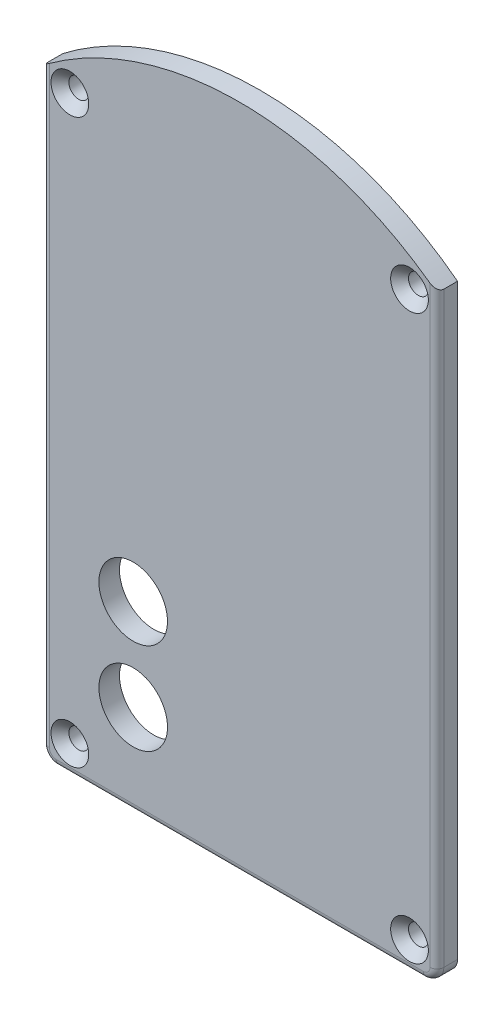
ISO-10303-21;
HEADER;
FILE_DESCRIPTION(('STEP AP214'),'2;1');
FILE_NAME('part.step','',(''),(''),'','','');
FILE_SCHEMA(('AUTOMOTIVE_DESIGN { 1 0 10303 214 1 1 1 1 }'));
ENDSEC;
DATA;
#1=APPLICATION_CONTEXT('core data for automotive mechanical design processes');
#2=APPLICATION_PROTOCOL_DEFINITION('international standard','automotive_design',2000,#1);
#3=PRODUCT_CONTEXT('',#1,'mechanical');
#4=PRODUCT('Part','Part','',(#3));
#5=PRODUCT_RELATED_PRODUCT_CATEGORY('part','',(#4));
#6=PRODUCT_DEFINITION_FORMATION('','',#4);
#7=PRODUCT_DEFINITION_CONTEXT('part definition',#1,'design');
#8=PRODUCT_DEFINITION('design','',#6,#7);
#9=PRODUCT_DEFINITION_SHAPE('','',#8);
#10=(LENGTH_UNIT() NAMED_UNIT(*) SI_UNIT(.MILLI.,.METRE.));
#11=(NAMED_UNIT(*) PLANE_ANGLE_UNIT() SI_UNIT($,.RADIAN.));
#12=(NAMED_UNIT(*) SI_UNIT($,.STERADIAN.) SOLID_ANGLE_UNIT());
#13=UNCERTAINTY_MEASURE_WITH_UNIT(LENGTH_MEASURE(1.E-05),#10,'distance_accuracy_value','');
#14=(GEOMETRIC_REPRESENTATION_CONTEXT(3) GLOBAL_UNCERTAINTY_ASSIGNED_CONTEXT((#13)) GLOBAL_UNIT_ASSIGNED_CONTEXT((#10,
#11,#12)) REPRESENTATION_CONTEXT('',''));
#15=CARTESIAN_POINT('',(0.,0.,0.));
#16=DIRECTION('',(0.,0.,1.));
#17=DIRECTION('',(1.,0.,0.));
#18=AXIS2_PLACEMENT_3D('',#15,#16,#17);
#19=CARTESIAN_POINT('',(26.75,-48.,2.));
#20=DIRECTION('',(0.,0.,1.));
#21=DIRECTION('',(1.,0.,0.));
#22=AXIS2_PLACEMENT_3D('',#19,#20,#21);
#23=DEGENERATE_TOROIDAL_SURFACE('',#22,1.,1.,.T.);
#24=CARTESIAN_POINT('',(27.75,-48.,2.));
#25=DIRECTION('',(0.,1.,0.));
#26=DIRECTION('',(0.,0.,1.));
#27=AXIS2_PLACEMENT_3D('',#24,#25,#26);
#28=CIRCLE('',#27,1.);
#29=CARTESIAN_POINT('',(27.75,-48.,3.));
#30=VERTEX_POINT('',#29);
#31=CARTESIAN_POINT('',(28.75,-48.,2.));
#32=VERTEX_POINT('',#31);
#33=EDGE_CURVE('E11',#30,#32,#28,.T.);
#34=ORIENTED_EDGE('',*,*,#33,.F.);
#35=CARTESIAN_POINT('',(26.75,-48.,3.));
#36=DIRECTION('',(0.,0.,1.));
#37=DIRECTION('',(1.,0.,0.));
#38=AXIS2_PLACEMENT_3D('',#35,#36,#37);
#39=CIRCLE('',#38,1.);
#40=CARTESIAN_POINT('',(26.75,-49.,3.));
#41=VERTEX_POINT('',#40);
#42=EDGE_CURVE('E157',#41,#30,#39,.T.);
#43=ORIENTED_EDGE('',*,*,#42,.F.);
#44=CARTESIAN_POINT('',(26.75,-49.,2.));
#45=DIRECTION('',(1.,0.,0.));
#46=DIRECTION('',(0.,0.,-1.));
#47=AXIS2_PLACEMENT_3D('',#44,#45,#46);
#48=CIRCLE('',#47,1.);
#49=CARTESIAN_POINT('',(26.75,-50.,2.));
#50=VERTEX_POINT('',#49);
#51=EDGE_CURVE('E44',#41,#50,#48,.T.);
#52=ORIENTED_EDGE('',*,*,#51,.T.);
#53=CARTESIAN_POINT('',(26.75,-48.,2.));
#54=DIRECTION('',(0.,0.,1.));
#55=DIRECTION('',(1.,0.,0.));
#56=AXIS2_PLACEMENT_3D('',#53,#54,#55);
#57=CIRCLE('',#56,2.);
#58=EDGE_CURVE('E217',#32,#50,#57,.F.);
#59=ORIENTED_EDGE('',*,*,#58,.F.);
#60=EDGE_LOOP('',(#34,#43,#52,#59));
#61=FACE_BOUND('',#60,.T.);
#62=ADVANCED_FACE('F37',(#61),#23,.T.);
#63=CARTESIAN_POINT('',(0.,-49.,2.));
#64=DIRECTION('',(-1.,0.,0.));
#65=DIRECTION('',(0.,0.,1.));
#66=AXIS2_PLACEMENT_3D('',#63,#64,#65);
#67=CYLINDRICAL_SURFACE('',#66,1.);
#68=ORIENTED_EDGE('',*,*,#51,.F.);
#69=DIRECTION('',(1.,0.,0.));
#70=VECTOR('',#69,1.);
#71=CARTESIAN_POINT('',(0.,-49.,3.));
#72=LINE('',#71,#70);
#73=CARTESIAN_POINT('',(-26.75,-49.,3.));
#74=VERTEX_POINT('',#73);
#75=EDGE_CURVE('E160',#74,#41,#72,.T.);
#76=ORIENTED_EDGE('',*,*,#75,.F.);
#77=CARTESIAN_POINT('',(-26.75,-49.,2.));
#78=DIRECTION('',(1.,0.,0.));
#79=DIRECTION('',(0.,0.,-1.));
#80=AXIS2_PLACEMENT_3D('',#77,#78,#79);
#81=CIRCLE('',#80,1.);
#82=CARTESIAN_POINT('',(-26.75,-50.,2.));
#83=VERTEX_POINT('',#82);
#84=EDGE_CURVE('E212',#74,#83,#81,.T.);
#85=ORIENTED_EDGE('',*,*,#84,.T.);
#86=DIRECTION('',(1.,0.,0.));
#87=VECTOR('',#86,1.);
#88=CARTESIAN_POINT('',(0.,-50.,2.));
#89=LINE('',#88,#87);
#90=EDGE_CURVE('E211',#50,#83,#89,.F.);
#91=ORIENTED_EDGE('',*,*,#90,.F.);
#92=EDGE_LOOP('',(#68,#76,#85,#91));
#93=FACE_BOUND('',#92,.T.);
#94=ADVANCED_FACE('F201',(#93),#67,.T.);
#95=CARTESIAN_POINT('',(-26.75,-48.,2.));
#96=DIRECTION('',(0.,0.,1.));
#97=DIRECTION('',(1.,0.,0.));
#98=AXIS2_PLACEMENT_3D('',#95,#96,#97);
#99=DEGENERATE_TOROIDAL_SURFACE('',#98,1.,1.,.T.);
#100=ORIENTED_EDGE('',*,*,#84,.F.);
#101=CARTESIAN_POINT('',(-26.75,-48.,3.));
#102=DIRECTION('',(0.,0.,1.));
#103=DIRECTION('',(1.,0.,0.));
#104=AXIS2_PLACEMENT_3D('',#101,#102,#103);
#105=CIRCLE('',#104,1.);
#106=CARTESIAN_POINT('',(-27.75,-48.,3.));
#107=VERTEX_POINT('',#106);
#108=EDGE_CURVE('E163',#107,#74,#105,.T.);
#109=ORIENTED_EDGE('',*,*,#108,.F.);
#110=CARTESIAN_POINT('',(-27.75,-48.,2.));
#111=DIRECTION('',(0.,-1.,0.));
#112=DIRECTION('',(0.,0.,-1.));
#113=AXIS2_PLACEMENT_3D('',#110,#111,#112);
#114=CIRCLE('',#113,1.);
#115=CARTESIAN_POINT('',(-28.75,-48.,2.));
#116=VERTEX_POINT('',#115);
#117=EDGE_CURVE('E226',#107,#116,#114,.T.);
#118=ORIENTED_EDGE('',*,*,#117,.T.);
#119=CARTESIAN_POINT('',(-26.75,-48.,2.));
#120=DIRECTION('',(0.,0.,1.));
#121=DIRECTION('',(1.,0.,0.));
#122=AXIS2_PLACEMENT_3D('',#119,#120,#121);
#123=CIRCLE('',#122,2.);
#124=EDGE_CURVE('E235',#83,#116,#123,.F.);
#125=ORIENTED_EDGE('',*,*,#124,.F.);
#126=EDGE_LOOP('',(#100,#109,#118,#125));
#127=FACE_BOUND('',#126,.T.);
#128=ADVANCED_FACE('F198',(#127),#99,.T.);
#129=CARTESIAN_POINT('',(-27.75,0.,2.));
#130=DIRECTION('',(0.,1.,0.));
#131=DIRECTION('',(-1.,0.,0.));
#132=AXIS2_PLACEMENT_3D('',#129,#130,#131);
#133=CYLINDRICAL_SURFACE('',#132,1.);
#134=ORIENTED_EDGE('',*,*,#117,.F.);
#135=DIRECTION('',(0.,-1.,0.));
#136=VECTOR('',#135,1.);
#137=CARTESIAN_POINT('',(-27.75,0.,3.));
#138=LINE('',#137,#136);
#139=CARTESIAN_POINT('',(-27.75,38.3537755638216,3.));
#140=VERTEX_POINT('',#139);
#141=EDGE_CURVE('E166',#140,#107,#138,.T.);
#142=ORIENTED_EDGE('',*,*,#141,.F.);
#143=CARTESIAN_POINT('',(-28.75,37.61,2.));
#144=CARTESIAN_POINT('',(-28.7500022722905,37.6099981037718,2.02410175027097));
#145=CARTESIAN_POINT('',(-28.7491279451692,37.6106666342027,2.04818996193009));
#146=CARTESIAN_POINT('',(-28.7456562797687,37.6133201448274,2.09615648428981));
#147=CARTESIAN_POINT('',(-28.7430598462691,37.6153044337333,2.12003489854455));
#148=CARTESIAN_POINT('',(-28.7327793158311,37.623158697966,2.19078854732016));
#149=CARTESIAN_POINT('',(-28.7226030260045,37.6309308415264,2.23712340857814));
#150=CARTESIAN_POINT('',(-28.6962330131471,37.6510435476155,2.32685198090156));
#151=CARTESIAN_POINT('',(-28.6800496066799,37.6633762777018,2.37025058446503));
#152=CARTESIAN_POINT('',(-28.6424784736019,37.6919564770102,2.45339460940018));
#153=CARTESIAN_POINT('',(-28.621083509407,37.7082093901011,2.49313484350643));
#154=CARTESIAN_POINT('',(-28.5722213409678,37.745248348285,2.5711629402715));
#155=CARTESIAN_POINT('',(-28.5444206175567,37.7662818195653,2.60912232766916));
#156=CARTESIAN_POINT('',(-28.4848435709094,37.8112374975394,2.67981174487165));
#157=CARTESIAN_POINT('',(-28.45306632852,37.8351603720602,2.7125405616596));
#158=CARTESIAN_POINT('',(-28.3798087803835,37.8901509322634,2.77860735748289));
#159=CARTESIAN_POINT('',(-28.3376505119854,37.9216974818019,2.81079387113862));
#160=CARTESIAN_POINT('',(-28.2500392453336,37.9870093175237,2.86757766108698));
#161=CARTESIAN_POINT('',(-28.2045825457174,38.0207770921761,2.89216624343736));
#162=CARTESIAN_POINT('',(-28.1020836384667,38.0966182542056,2.93796848285641));
#163=CARTESIAN_POINT('',(-28.0445372550535,38.139006266507,2.95753435291841));
#164=CARTESIAN_POINT('',(-27.9276306421015,38.2246946713548,2.98593097636432));
#165=CARTESIAN_POINT('',(-27.8682729358103,38.2679937707442,2.99477602192797));
#166=CARTESIAN_POINT('',(-27.7891241366535,38.3254455467905,2.99942566566217));
#167=CARTESIAN_POINT('',(-27.7695639070646,38.3396208652445,2.9999995816304));
#168=CARTESIAN_POINT('',(-27.75,38.3537755638216,3.));
#169=B_SPLINE_CURVE_WITH_KNOTS('',3,(#143,#144,#145,#146,#147,#148,#149,#150,#151,#152,#153,
#154,#155,#156,#157,#158,#159,#160,#161,#162,#163,#164,#165,#166,#167,#168),.UNSPECIFIED.,.F.,
.F.,(4,2,2,2,2,2,2,2,2,2,2,2,4),(0.,0.0722541456494997,0.144470359646708,0.287893976458827,
0.431072410065434,0.574450828771389,0.728505209145205,0.882595264448869,1.0670573316286,
1.25172969476195,1.47318614546049,1.69434704156364,1.7668073530059),.UNSPECIFIED.);
#170=CARTESIAN_POINT('',(-28.75,37.61,2.));
#171=VERTEX_POINT('',#170);
#172=EDGE_CURVE('E178',#171,#140,#169,.T.);
#173=ORIENTED_EDGE('',*,*,#172,.F.);
#174=DIRECTION('',(0.,-1.,0.));
#175=VECTOR('',#174,1.);
#176=CARTESIAN_POINT('',(-28.75,0.,2.));
#177=LINE('',#176,#175);
#178=EDGE_CURVE('E113',#116,#171,#177,.F.);
#179=ORIENTED_EDGE('',*,*,#178,.F.);
#180=EDGE_LOOP('',(#134,#142,#173,#179));
#181=FACE_BOUND('',#180,.T.);
#182=ADVANCED_FACE('F193',(#181),#133,.T.);
#183=CARTESIAN_POINT('',(27.75,0.,2.));
#184=DIRECTION('',(0.,-1.,0.));
#185=DIRECTION('',(1.,0.,0.));
#186=AXIS2_PLACEMENT_3D('',#183,#184,#185);
#187=CYLINDRICAL_SURFACE('',#186,1.);
#188=DIRECTION('',(0.,1.,0.));
#189=VECTOR('',#188,1.);
#190=CARTESIAN_POINT('',(27.75,0.,3.));
#191=LINE('',#190,#189);
#192=CARTESIAN_POINT('',(27.75,38.3537755638216,3.));
#193=VERTEX_POINT('',#192);
#194=EDGE_CURVE('E154',#30,#193,#191,.T.);
#195=ORIENTED_EDGE('',*,*,#194,.F.);
#196=ORIENTED_EDGE('',*,*,#33,.T.);
#197=DIRECTION('',(0.,1.,0.));
#198=VECTOR('',#197,1.);
#199=CARTESIAN_POINT('',(28.75,0.,2.));
#200=LINE('',#199,#198);
#201=CARTESIAN_POINT('',(28.75,37.61,2.));
#202=VERTEX_POINT('',#201);
#203=EDGE_CURVE('E221',#202,#32,#200,.F.);
#204=ORIENTED_EDGE('',*,*,#203,.F.);
#205=CARTESIAN_POINT('',(27.75,38.3537755638216,3.));
#206=CARTESIAN_POINT('',(27.8184181665754,38.3042849041995,2.99996498562351));
#207=CARTESIAN_POINT('',(27.8867670368836,38.2545423580024,2.99297235887581));
#208=CARTESIAN_POINT('',(28.0219913192911,38.1555952864358,2.96481148038245));
#209=CARTESIAN_POINT('',(28.0888441042951,38.10640168804,2.94349699243492));
#210=CARTESIAN_POINT('',(28.2177655141988,38.011034636967,2.88663448323563));
#211=CARTESIAN_POINT('',(28.27986547152,37.9648417765026,2.85119139049506));
#212=CARTESIAN_POINT('',(28.396944823377,37.8773468475039,2.76594119668793));
#213=CARTESIAN_POINT('',(28.4519582166699,37.8360215149637,2.71620668499692));
#214=CARTESIAN_POINT('',(28.5341632679123,37.7740360505548,2.62249978544291));
#215=CARTESIAN_POINT('',(28.5643614992486,37.7511991837649,2.58258103775148));
#216=CARTESIAN_POINT('',(28.619189459037,37.7096509294579,2.49707454196982));
#217=CARTESIAN_POINT('',(28.6438189291835,37.69093973331,2.45148653106431));
#218=CARTESIAN_POINT('',(28.6863535248993,37.6585773624755,2.35503007169893));
#219=CARTESIAN_POINT('',(28.7041955639022,37.6449736746313,2.30411743611234));
#220=CARTESIAN_POINT('',(28.7315126278006,37.6241290487321,2.19890732222184));
#221=CARTESIAN_POINT('',(28.7410116052889,37.6168698960689,2.14462001614855));
#222=CARTESIAN_POINT('',(28.7473069477977,37.6120584836836,2.0748754785192));
#223=CARTESIAN_POINT('',(28.7483165592948,37.6112868019096,2.05991954871388));
#224=CARTESIAN_POINT('',(28.7496620131079,37.6102583836259,2.02997832766394));
#225=CARTESIAN_POINT('',(28.749998689021,37.6100010100185,2.01499309579164));
#226=CARTESIAN_POINT('',(28.75,37.61,2.));
#227=B_SPLINE_CURVE_WITH_KNOTS('',3,(#205,#206,#207,#208,#209,#210,#211,#212,#213,#214,#215,
#216,#217,#218,#219,#220,#221,#222,#223,#224,#225,#226),.UNSPECIFIED.,.F.,.F.,(4,2,2,2,2,2,2,2,
2,2,4),(0.,0.253197121276922,0.509019660948762,0.762976668339778,1.01566590506285,
1.18010633079928,1.34455438249659,1.51049559742968,1.67595882975645,1.72097226731186,
1.76592990996017),.UNSPECIFIED.);
#228=EDGE_CURVE('E170',#193,#202,#227,.T.);
#229=ORIENTED_EDGE('',*,*,#228,.F.);
#230=EDGE_LOOP('',(#195,#196,#204,#229));
#231=FACE_BOUND('',#230,.T.);
#232=ADVANCED_FACE('F188',(#231),#187,.T.);
#233=CARTESIAN_POINT('',(26.75,-48.,3.));
#234=DIRECTION('',(0.,0.,-1.));
#235=DIRECTION('',(-1.,0.,0.));
#236=AXIS2_PLACEMENT_3D('',#233,#234,#235);
#237=CYLINDRICAL_SURFACE('',#236,2.);
#238=DIRECTION('',(0.,0.,-1.));
#239=VECTOR('',#238,1.);
#240=CARTESIAN_POINT('',(28.75,-48.,3.));
#241=LINE('',#240,#239);
#242=CARTESIAN_POINT('',(28.75,-48.,0.));
#243=VERTEX_POINT('',#242);
#244=EDGE_CURVE('E147',#32,#243,#241,.T.);
#245=ORIENTED_EDGE('',*,*,#244,.F.);
#246=ORIENTED_EDGE('',*,*,#58,.T.);
#247=DIRECTION('',(0.,0.,-1.));
#248=VECTOR('',#247,1.);
#249=CARTESIAN_POINT('',(26.75,-50.,3.));
#250=LINE('',#249,#248);
#251=CARTESIAN_POINT('',(26.75,-50.,0.));
#252=VERTEX_POINT('',#251);
#253=EDGE_CURVE('E149',#252,#50,#250,.F.);
#254=ORIENTED_EDGE('',*,*,#253,.F.);
#255=CARTESIAN_POINT('',(26.75,-48.,0.));
#256=DIRECTION('',(0.,0.,1.));
#257=DIRECTION('',(1.,0.,0.));
#258=AXIS2_PLACEMENT_3D('',#255,#256,#257);
#259=CIRCLE('',#258,2.);
#260=EDGE_CURVE('E152',#243,#252,#259,.F.);
#261=ORIENTED_EDGE('',*,*,#260,.F.);
#262=EDGE_LOOP('',(#245,#246,#254,#261));
#263=FACE_BOUND('',#262,.T.);
#264=ADVANCED_FACE('F192',(#263),#237,.T.);
#265=CARTESIAN_POINT('',(-26.75,-48.,3.));
#266=DIRECTION('',(0.,0.,-1.));
#267=DIRECTION('',(-1.,0.,0.));
#268=AXIS2_PLACEMENT_3D('',#265,#266,#267);
#269=CYLINDRICAL_SURFACE('',#268,2.);
#270=DIRECTION('',(0.,0.,-1.));
#271=VECTOR('',#270,1.);
#272=CARTESIAN_POINT('',(-26.75,-50.,3.));
#273=LINE('',#272,#271);
#274=CARTESIAN_POINT('',(-26.75,-50.,0.));
#275=VERTEX_POINT('',#274);
#276=EDGE_CURVE('E138',#83,#275,#273,.T.);
#277=ORIENTED_EDGE('',*,*,#276,.F.);
#278=ORIENTED_EDGE('',*,*,#124,.T.);
#279=DIRECTION('',(0.,0.,-1.));
#280=VECTOR('',#279,1.);
#281=CARTESIAN_POINT('',(-28.75,-48.,3.));
#282=LINE('',#281,#280);
#283=CARTESIAN_POINT('',(-28.75,-48.,0.));
#284=VERTEX_POINT('',#283);
#285=EDGE_CURVE('E144',#284,#116,#282,.F.);
#286=ORIENTED_EDGE('',*,*,#285,.F.);
#287=CARTESIAN_POINT('',(-26.75,-48.,0.));
#288=DIRECTION('',(0.,0.,1.));
#289=DIRECTION('',(1.,0.,0.));
#290=AXIS2_PLACEMENT_3D('',#287,#288,#289);
#291=CIRCLE('',#290,2.);
#292=EDGE_CURVE('E132',#275,#284,#291,.F.);
#293=ORIENTED_EDGE('',*,*,#292,.F.);
#294=EDGE_LOOP('',(#277,#278,#286,#293));
#295=FACE_BOUND('',#294,.T.);
#296=ADVANCED_FACE('F238',(#295),#269,.T.);
#297=CARTESIAN_POINT('',(28.75,50.,3.));
#298=DIRECTION('',(-1.,0.,0.));
#299=DIRECTION('',(0.,-1.,0.));
#300=AXIS2_PLACEMENT_3D('',#297,#298,#299);
#301=PLANE('',#300);
#302=DIRECTION('',(0.,0.,-1.));
#303=VECTOR('',#302,1.);
#304=CARTESIAN_POINT('',(28.75,37.61,3.001));
#305=LINE('',#304,#303);
#306=CARTESIAN_POINT('',(28.75,37.61,0.));
#307=VERTEX_POINT('',#306);
#308=EDGE_CURVE('E116',#202,#307,#305,.T.);
#309=ORIENTED_EDGE('',*,*,#308,.F.);
#310=ORIENTED_EDGE('',*,*,#203,.T.);
#311=ORIENTED_EDGE('',*,*,#244,.T.);
#312=DIRECTION('',(0.,1.,0.));
#313=VECTOR('',#312,1.);
#314=CARTESIAN_POINT('',(28.75,50.,0.));
#315=LINE('',#314,#313);
#316=EDGE_CURVE('E135',#243,#307,#315,.T.);
#317=ORIENTED_EDGE('',*,*,#316,.T.);
#318=EDGE_LOOP('',(#309,#310,#311,#317));
#319=FACE_BOUND('',#318,.T.);
#320=ADVANCED_FACE('F225',(#319),#301,.F.);
#321=CARTESIAN_POINT('',(-28.75,50.,3.));
#322=DIRECTION('',(1.,0.,0.));
#323=DIRECTION('',(0.,1.,0.));
#324=AXIS2_PLACEMENT_3D('',#321,#322,#323);
#325=PLANE('',#324);
#326=ORIENTED_EDGE('',*,*,#285,.T.);
#327=ORIENTED_EDGE('',*,*,#178,.T.);
#328=DIRECTION('',(0.,0.,-1.));
#329=VECTOR('',#328,1.);
#330=CARTESIAN_POINT('',(-28.75,37.61,3.001));
#331=LINE('',#330,#329);
#332=CARTESIAN_POINT('',(-28.75,37.61,0.));
#333=VERTEX_POINT('',#332);
#334=EDGE_CURVE('E106',#171,#333,#331,.T.);
#335=ORIENTED_EDGE('',*,*,#334,.T.);
#336=DIRECTION('',(0.,-1.,0.));
#337=VECTOR('',#336,1.);
#338=CARTESIAN_POINT('',(-28.75,50.,0.));
#339=LINE('',#338,#337);
#340=EDGE_CURVE('E111',#333,#284,#339,.T.);
#341=ORIENTED_EDGE('',*,*,#340,.T.);
#342=EDGE_LOOP('',(#326,#327,#335,#341));
#343=FACE_BOUND('',#342,.T.);
#344=ADVANCED_FACE('F109',(#343),#325,.F.);
#345=CARTESIAN_POINT('',(-28.75,-50.,3.));
#346=DIRECTION('',(0.,1.,0.));
#347=DIRECTION('',(0.,0.,1.));
#348=AXIS2_PLACEMENT_3D('',#345,#346,#347);
#349=PLANE('',#348);
#350=ORIENTED_EDGE('',*,*,#253,.T.);
#351=ORIENTED_EDGE('',*,*,#90,.T.);
#352=ORIENTED_EDGE('',*,*,#276,.T.);
#353=DIRECTION('',(1.,0.,0.));
#354=VECTOR('',#353,1.);
#355=CARTESIAN_POINT('',(-28.75,-50.,0.));
#356=LINE('',#355,#354);
#357=EDGE_CURVE('E134',#275,#252,#356,.T.);
#358=ORIENTED_EDGE('',*,*,#357,.T.);
#359=EDGE_LOOP('',(#350,#351,#352,#358));
#360=FACE_BOUND('',#359,.T.);
#361=ADVANCED_FACE('F233',(#360),#349,.F.);
#362=CARTESIAN_POINT('',(0.,0.,3.));
#363=DIRECTION('',(0.,0.,1.));
#364=DIRECTION('',(1.,0.,0.));
#365=AXIS2_PLACEMENT_3D('',#362,#363,#364);
#366=PLANE('',#365);
#367=CARTESIAN_POINT('',(-24.75,36.11,3.));
#368=DIRECTION('',(0.,0.,1.));
#369=DIRECTION('',(1.,0.,0.));
#370=AXIS2_PLACEMENT_3D('',#367,#368,#369);
#371=CIRCLE('',#370,2.75);
#372=CARTESIAN_POINT('',(-22.,36.11,3.));
#373=VERTEX_POINT('',#372);
#374=EDGE_CURVE('E319',#373,#373,#371,.T.);
#375=ORIENTED_EDGE('',*,*,#374,.F.);
#376=EDGE_LOOP('',(#375));
#377=FACE_BOUND('',#376,.T.);
#378=CARTESIAN_POINT('',(24.75,-46.,3.));
#379=DIRECTION('',(0.,0.,1.));
#380=DIRECTION('',(1.,0.,0.));
#381=AXIS2_PLACEMENT_3D('',#378,#379,#380);
#382=CIRCLE('',#381,2.75);
#383=CARTESIAN_POINT('',(27.5,-46.,3.));
#384=VERTEX_POINT('',#383);
#385=EDGE_CURVE('E310',#384,#384,#382,.T.);
#386=ORIENTED_EDGE('',*,*,#385,.F.);
#387=EDGE_LOOP('',(#386));
#388=FACE_BOUND('',#387,.T.);
#389=CARTESIAN_POINT('',(-24.75,-46.,3.));
#390=DIRECTION('',(0.,0.,1.));
#391=DIRECTION('',(1.,0.,0.));
#392=AXIS2_PLACEMENT_3D('',#389,#390,#391);
#393=CIRCLE('',#392,2.75);
#394=CARTESIAN_POINT('',(-22.,-46.,3.));
#395=VERTEX_POINT('',#394);
#396=EDGE_CURVE('E301',#395,#395,#393,.T.);
#397=ORIENTED_EDGE('',*,*,#396,.F.);
#398=EDGE_LOOP('',(#397));
#399=FACE_BOUND('',#398,.T.);
#400=CARTESIAN_POINT('',(24.75,36.11,3.));
#401=DIRECTION('',(0.,0.,1.));
#402=DIRECTION('',(1.,0.,0.));
#403=AXIS2_PLACEMENT_3D('',#400,#401,#402);
#404=CIRCLE('',#403,2.75);
#405=CARTESIAN_POINT('',(27.5,36.11,3.));
#406=VERTEX_POINT('',#405);
#407=EDGE_CURVE('E289',#406,#406,#404,.T.);
#408=ORIENTED_EDGE('',*,*,#407,.F.);
#409=EDGE_LOOP('',(#408));
#410=FACE_BOUND('',#409,.T.);
#411=CARTESIAN_POINT('',(-15.52,-36.81,3.));
#412=DIRECTION('',(0.,0.,1.));
#413=DIRECTION('',(1.,0.,0.));
#414=AXIS2_PLACEMENT_3D('',#411,#412,#413);
#415=CIRCLE('',#414,4.99999999999999);
#416=CARTESIAN_POINT('',(-20.52,-36.81,3.));
#417=VERTEX_POINT('',#416);
#418=EDGE_CURVE('E126',#417,#417,#415,.T.);
#419=ORIENTED_EDGE('',*,*,#418,.F.);
#420=EDGE_LOOP('',(#419));
#421=FACE_BOUND('',#420,.T.);
#422=CARTESIAN_POINT('',(-15.52,-23.47,3.));
#423=DIRECTION('',(0.,0.,1.));
#424=DIRECTION('',(1.,0.,0.));
#425=AXIS2_PLACEMENT_3D('',#422,#423,#424);
#426=CIRCLE('',#425,5.);
#427=CARTESIAN_POINT('',(-20.52,-23.47,3.));
#428=VERTEX_POINT('',#427);
#429=EDGE_CURVE('E272',#428,#428,#426,.T.);
#430=ORIENTED_EDGE('',*,*,#429,.F.);
#431=EDGE_LOOP('',(#430));
#432=FACE_BOUND('',#431,.T.);
#433=CARTESIAN_POINT('',(0.,0.,3.));
#434=DIRECTION('',(0.,0.,1.));
#435=DIRECTION('',(1.,0.,0.));
#436=AXIS2_PLACEMENT_3D('',#433,#434,#435);
#437=CIRCLE('',#436,47.3399894381061);
#438=EDGE_CURVE('E115',#140,#193,#437,.F.);
#439=ORIENTED_EDGE('',*,*,#438,.F.);
#440=ORIENTED_EDGE('',*,*,#141,.T.);
#441=ORIENTED_EDGE('',*,*,#108,.T.);
#442=ORIENTED_EDGE('',*,*,#75,.T.);
#443=ORIENTED_EDGE('',*,*,#42,.T.);
#444=ORIENTED_EDGE('',*,*,#194,.T.);
#445=EDGE_LOOP('',(#439,#440,#441,#442,#443,#444));
#446=FACE_BOUND('',#445,.T.);
#447=ADVANCED_FACE('F215',(#377,#388,#399,#410,#421,#432,#446),#366,.T.);
#448=CARTESIAN_POINT('',(0.,0.,0.));
#449=DIRECTION('',(0.,0.,1.));
#450=DIRECTION('',(1.,0.,0.));
#451=AXIS2_PLACEMENT_3D('',#448,#449,#450);
#452=PLANE('',#451);
#453=CARTESIAN_POINT('',(-24.75,36.11,0.));
#454=DIRECTION('',(0.,0.,1.));
#455=DIRECTION('',(1.,0.,0.));
#456=AXIS2_PLACEMENT_3D('',#453,#454,#455);
#457=CIRCLE('',#456,1.45);
#458=CARTESIAN_POINT('',(-23.3,36.11,0.));
#459=VERTEX_POINT('',#458);
#460=EDGE_CURVE('E313',#459,#459,#457,.T.);
#461=ORIENTED_EDGE('',*,*,#460,.T.);
#462=EDGE_LOOP('',(#461));
#463=FACE_BOUND('',#462,.T.);
#464=CARTESIAN_POINT('',(24.75,-46.,0.));
#465=DIRECTION('',(0.,0.,1.));
#466=DIRECTION('',(1.,0.,0.));
#467=AXIS2_PLACEMENT_3D('',#464,#465,#466);
#468=CIRCLE('',#467,1.45);
#469=CARTESIAN_POINT('',(26.2,-46.,0.));
#470=VERTEX_POINT('',#469);
#471=EDGE_CURVE('E304',#470,#470,#468,.T.);
#472=ORIENTED_EDGE('',*,*,#471,.T.);
#473=EDGE_LOOP('',(#472));
#474=FACE_BOUND('',#473,.T.);
#475=CARTESIAN_POINT('',(-24.75,-46.,0.));
#476=DIRECTION('',(0.,0.,1.));
#477=DIRECTION('',(1.,0.,0.));
#478=AXIS2_PLACEMENT_3D('',#475,#476,#477);
#479=CIRCLE('',#478,1.45);
#480=CARTESIAN_POINT('',(-23.3,-46.,0.));
#481=VERTEX_POINT('',#480);
#482=EDGE_CURVE('E295',#481,#481,#479,.T.);
#483=ORIENTED_EDGE('',*,*,#482,.T.);
#484=EDGE_LOOP('',(#483));
#485=FACE_BOUND('',#484,.T.);
#486=CARTESIAN_POINT('',(24.75,36.11,0.));
#487=DIRECTION('',(0.,0.,1.));
#488=DIRECTION('',(1.,0.,0.));
#489=AXIS2_PLACEMENT_3D('',#486,#487,#488);
#490=CIRCLE('',#489,1.45);
#491=CARTESIAN_POINT('',(26.2,36.11,0.));
#492=VERTEX_POINT('',#491);
#493=EDGE_CURVE('E280',#492,#492,#490,.T.);
#494=ORIENTED_EDGE('',*,*,#493,.T.);
#495=EDGE_LOOP('',(#494));
#496=FACE_BOUND('',#495,.T.);
#497=ORIENTED_EDGE('',*,*,#316,.F.);
#498=ORIENTED_EDGE('',*,*,#260,.T.);
#499=ORIENTED_EDGE('',*,*,#357,.F.);
#500=ORIENTED_EDGE('',*,*,#292,.T.);
#501=ORIENTED_EDGE('',*,*,#340,.F.);
#502=CARTESIAN_POINT('',(0.,0.,0.));
#503=DIRECTION('',(0.,0.,-1.));
#504=DIRECTION('',(-1.,0.,0.));
#505=AXIS2_PLACEMENT_3D('',#502,#503,#504);
#506=CIRCLE('',#505,47.3399894381061);
#507=EDGE_CURVE('E119',#333,#307,#506,.T.);
#508=ORIENTED_EDGE('',*,*,#507,.T.);
#509=EDGE_LOOP('',(#497,#498,#499,#500,#501,#508));
#510=FACE_BOUND('',#509,.T.);
#511=CARTESIAN_POINT('',(-15.52,-36.81,0.));
#512=DIRECTION('',(0.,0.,1.));
#513=DIRECTION('',(1.,0.,0.));
#514=AXIS2_PLACEMENT_3D('',#511,#512,#513);
#515=CIRCLE('',#514,4.99999999999999);
#516=CARTESIAN_POINT('',(-20.52,-36.81,0.));
#517=VERTEX_POINT('',#516);
#518=EDGE_CURVE('E271',#517,#517,#515,.T.);
#519=ORIENTED_EDGE('',*,*,#518,.T.);
#520=EDGE_LOOP('',(#519));
#521=FACE_BOUND('',#520,.T.);
#522=CARTESIAN_POINT('',(-15.52,-23.47,0.));
#523=DIRECTION('',(0.,0.,1.));
#524=DIRECTION('',(1.,0.,0.));
#525=AXIS2_PLACEMENT_3D('',#522,#523,#524);
#526=CIRCLE('',#525,5.);
#527=CARTESIAN_POINT('',(-20.52,-23.47,0.));
#528=VERTEX_POINT('',#527);
#529=EDGE_CURVE('E276',#528,#528,#526,.T.);
#530=ORIENTED_EDGE('',*,*,#529,.T.);
#531=EDGE_LOOP('',(#530));
#532=FACE_BOUND('',#531,.T.);
#533=ADVANCED_FACE('F128',(#463,#474,#485,#496,#510,#521,#532),#452,.F.);
#534=CARTESIAN_POINT('',(-15.52,-23.47,3.001));
#535=DIRECTION('',(0.,0.,-1.));
#536=DIRECTION('',(-1.,0.,0.));
#537=AXIS2_PLACEMENT_3D('',#534,#535,#536);
#538=CYLINDRICAL_SURFACE('',#537,5.);
#539=CARTESIAN_POINT('',(-20.52,-23.47,3.));
#540=CARTESIAN_POINT('',(-20.52,-23.47,2.96875));
#541=CARTESIAN_POINT('',(-20.52,-23.47,2.9375));
#542=CARTESIAN_POINT('',(-20.52,-23.47,2.875));
#543=CARTESIAN_POINT('',(-20.52,-23.47,2.84375));
#544=CARTESIAN_POINT('',(-20.52,-23.47,2.78125));
#545=CARTESIAN_POINT('',(-20.52,-23.47,2.75));
#546=CARTESIAN_POINT('',(-20.52,-23.47,2.6875));
#547=CARTESIAN_POINT('',(-20.52,-23.47,2.65625));
#548=CARTESIAN_POINT('',(-20.52,-23.47,2.59375));
#549=CARTESIAN_POINT('',(-20.52,-23.47,2.5625));
#550=CARTESIAN_POINT('',(-20.52,-23.47,2.5));
#551=CARTESIAN_POINT('',(-20.52,-23.47,2.46875));
#552=CARTESIAN_POINT('',(-20.52,-23.47,2.40625));
#553=CARTESIAN_POINT('',(-20.52,-23.47,2.375));
#554=CARTESIAN_POINT('',(-20.52,-23.47,2.3125));
#555=CARTESIAN_POINT('',(-20.52,-23.47,2.28125));
#556=CARTESIAN_POINT('',(-20.52,-23.47,2.21875));
#557=CARTESIAN_POINT('',(-20.52,-23.47,2.1875));
#558=CARTESIAN_POINT('',(-20.52,-23.47,2.125));
#559=CARTESIAN_POINT('',(-20.52,-23.47,2.09375));
#560=CARTESIAN_POINT('',(-20.52,-23.47,2.03125));
#561=CARTESIAN_POINT('',(-20.52,-23.47,2.));
#562=CARTESIAN_POINT('',(-20.52,-23.47,1.9375));
#563=CARTESIAN_POINT('',(-20.52,-23.47,1.90625));
#564=CARTESIAN_POINT('',(-20.52,-23.47,1.84375));
#565=CARTESIAN_POINT('',(-20.52,-23.47,1.8125));
#566=CARTESIAN_POINT('',(-20.52,-23.47,1.75));
#567=CARTESIAN_POINT('',(-20.52,-23.47,1.71875));
#568=CARTESIAN_POINT('',(-20.52,-23.47,1.65625));
#569=CARTESIAN_POINT('',(-20.52,-23.47,1.625));
#570=CARTESIAN_POINT('',(-20.52,-23.47,1.5625));
#571=CARTESIAN_POINT('',(-20.52,-23.47,1.53125));
#572=CARTESIAN_POINT('',(-20.52,-23.47,1.46875));
#573=CARTESIAN_POINT('',(-20.52,-23.47,1.4375));
#574=CARTESIAN_POINT('',(-20.52,-23.47,1.375));
#575=CARTESIAN_POINT('',(-20.52,-23.47,1.34375));
#576=CARTESIAN_POINT('',(-20.52,-23.47,1.28125));
#577=CARTESIAN_POINT('',(-20.52,-23.47,1.25));
#578=CARTESIAN_POINT('',(-20.52,-23.47,1.1875));
#579=CARTESIAN_POINT('',(-20.52,-23.47,1.15625));
#580=CARTESIAN_POINT('',(-20.52,-23.47,1.09375));
#581=CARTESIAN_POINT('',(-20.52,-23.47,1.0625));
#582=CARTESIAN_POINT('',(-20.52,-23.47,1.));
#583=CARTESIAN_POINT('',(-20.52,-23.47,0.96875));
#584=CARTESIAN_POINT('',(-20.52,-23.47,0.90625));
#585=CARTESIAN_POINT('',(-20.52,-23.47,0.875));
#586=CARTESIAN_POINT('',(-20.52,-23.47,0.8125));
#587=CARTESIAN_POINT('',(-20.52,-23.47,0.78125));
#588=CARTESIAN_POINT('',(-20.52,-23.47,0.71875));
#589=CARTESIAN_POINT('',(-20.52,-23.47,0.6875));
#590=CARTESIAN_POINT('',(-20.52,-23.47,0.625));
#591=CARTESIAN_POINT('',(-20.52,-23.47,0.59375));
#592=CARTESIAN_POINT('',(-20.52,-23.47,0.53125));
#593=CARTESIAN_POINT('',(-20.52,-23.47,0.5));
#594=CARTESIAN_POINT('',(-20.52,-23.47,0.4375));
#595=CARTESIAN_POINT('',(-20.52,-23.47,0.40625));
#596=CARTESIAN_POINT('',(-20.52,-23.47,0.34375));
#597=CARTESIAN_POINT('',(-20.52,-23.47,0.3125));
#598=CARTESIAN_POINT('',(-20.52,-23.47,0.25));
#599=CARTESIAN_POINT('',(-20.52,-23.47,0.21875));
#600=CARTESIAN_POINT('',(-20.52,-23.47,0.15625));
#601=CARTESIAN_POINT('',(-20.52,-23.47,0.125));
#602=CARTESIAN_POINT('',(-20.52,-23.47,0.0624999999999996));
#603=CARTESIAN_POINT('',(-20.52,-23.47,0.0312499999999996));
#604=CARTESIAN_POINT('',(-20.52,-23.47,0.));
#605=B_SPLINE_CURVE_WITH_KNOTS('',3,(#539,#540,#541,#542,#543,#544,#545,#546,#547,#548,#549,
#550,#551,#552,#553,#554,#555,#556,#557,#558,#559,#560,#561,#562,#563,#564,#565,#566,#567,#568,
#569,#570,#571,#572,#573,#574,#575,#576,#577,#578,#579,#580,#581,#582,#583,#584,#585,#586,#587,
#588,#589,#590,#591,#592,#593,#594,#595,#596,#597,#598,#599,#600,#601,#602,#603,#604),
.UNSPECIFIED.,.F.,.F.,(4,2,2,2,2,2,2,2,2,2,2,2,2,2,2,2,2,2,2,2,2,2,2,2,2,2,2,2,2,2,2,2,4),(0.,
0.0937499999999997,0.1875,0.28125,0.375,0.46875,0.5625,0.65625,0.75,0.84375,0.9375,1.03125,
1.125,1.21875,1.3125,1.40625,1.5,1.59375,1.6875,1.78125,1.875,1.96875,2.0625,2.15625,2.25,
2.34375,2.4375,2.53125,2.625,2.71875,2.8125,2.90625,3.),.UNSPECIFIED.);
#606=EDGE_CURVE('BSEAM252',#428,#528,#605,.T.);
#607=ORIENTED_EDGE('',*,*,#429,.T.);
#608=ORIENTED_EDGE('',*,*,#529,.F.);
#609=ORIENTED_EDGE('',*,*,#606,.T.);
#610=ORIENTED_EDGE('',*,*,#606,.F.);
#611=EDGE_LOOP('',(#607,#609,#608,#610));
#612=FACE_BOUND('',#611,.T.);
#613=ADVANCED_FACE('F252',(#612),#538,.F.);
#614=CARTESIAN_POINT('',(-15.52,-36.81,3.001));
#615=DIRECTION('',(0.,0.,-1.));
#616=DIRECTION('',(-1.,0.,0.));
#617=AXIS2_PLACEMENT_3D('',#614,#615,#616);
#618=CYLINDRICAL_SURFACE('',#617,4.99999999999999);
#619=CARTESIAN_POINT('',(-20.52,-36.81,3.));
#620=CARTESIAN_POINT('',(-20.52,-36.81,2.96875));
#621=CARTESIAN_POINT('',(-20.52,-36.81,2.9375));
#622=CARTESIAN_POINT('',(-20.52,-36.81,2.875));
#623=CARTESIAN_POINT('',(-20.52,-36.81,2.84375));
#624=CARTESIAN_POINT('',(-20.52,-36.81,2.78125));
#625=CARTESIAN_POINT('',(-20.52,-36.81,2.75));
#626=CARTESIAN_POINT('',(-20.52,-36.81,2.6875));
#627=CARTESIAN_POINT('',(-20.52,-36.81,2.65625));
#628=CARTESIAN_POINT('',(-20.52,-36.81,2.59375));
#629=CARTESIAN_POINT('',(-20.52,-36.81,2.5625));
#630=CARTESIAN_POINT('',(-20.52,-36.81,2.5));
#631=CARTESIAN_POINT('',(-20.52,-36.81,2.46875));
#632=CARTESIAN_POINT('',(-20.52,-36.81,2.40625));
#633=CARTESIAN_POINT('',(-20.52,-36.81,2.375));
#634=CARTESIAN_POINT('',(-20.52,-36.81,2.3125));
#635=CARTESIAN_POINT('',(-20.52,-36.81,2.28125));
#636=CARTESIAN_POINT('',(-20.52,-36.81,2.21875));
#637=CARTESIAN_POINT('',(-20.52,-36.81,2.1875));
#638=CARTESIAN_POINT('',(-20.52,-36.81,2.125));
#639=CARTESIAN_POINT('',(-20.52,-36.81,2.09375));
#640=CARTESIAN_POINT('',(-20.52,-36.81,2.03125));
#641=CARTESIAN_POINT('',(-20.52,-36.81,2.));
#642=CARTESIAN_POINT('',(-20.52,-36.81,1.9375));
#643=CARTESIAN_POINT('',(-20.52,-36.81,1.90625));
#644=CARTESIAN_POINT('',(-20.52,-36.81,1.84375));
#645=CARTESIAN_POINT('',(-20.52,-36.81,1.8125));
#646=CARTESIAN_POINT('',(-20.52,-36.81,1.75));
#647=CARTESIAN_POINT('',(-20.52,-36.81,1.71875));
#648=CARTESIAN_POINT('',(-20.52,-36.81,1.65625));
#649=CARTESIAN_POINT('',(-20.52,-36.81,1.625));
#650=CARTESIAN_POINT('',(-20.52,-36.81,1.5625));
#651=CARTESIAN_POINT('',(-20.52,-36.81,1.53125));
#652=CARTESIAN_POINT('',(-20.52,-36.81,1.46875));
#653=CARTESIAN_POINT('',(-20.52,-36.81,1.4375));
#654=CARTESIAN_POINT('',(-20.52,-36.81,1.375));
#655=CARTESIAN_POINT('',(-20.52,-36.81,1.34375));
#656=CARTESIAN_POINT('',(-20.52,-36.81,1.28125));
#657=CARTESIAN_POINT('',(-20.52,-36.81,1.25));
#658=CARTESIAN_POINT('',(-20.52,-36.81,1.1875));
#659=CARTESIAN_POINT('',(-20.52,-36.81,1.15625));
#660=CARTESIAN_POINT('',(-20.52,-36.81,1.09375));
#661=CARTESIAN_POINT('',(-20.52,-36.81,1.0625));
#662=CARTESIAN_POINT('',(-20.52,-36.81,1.));
#663=CARTESIAN_POINT('',(-20.52,-36.81,0.96875));
#664=CARTESIAN_POINT('',(-20.52,-36.81,0.90625));
#665=CARTESIAN_POINT('',(-20.52,-36.81,0.875));
#666=CARTESIAN_POINT('',(-20.52,-36.81,0.8125));
#667=CARTESIAN_POINT('',(-20.52,-36.81,0.78125));
#668=CARTESIAN_POINT('',(-20.52,-36.81,0.71875));
#669=CARTESIAN_POINT('',(-20.52,-36.81,0.6875));
#670=CARTESIAN_POINT('',(-20.52,-36.81,0.625));
#671=CARTESIAN_POINT('',(-20.52,-36.81,0.59375));
#672=CARTESIAN_POINT('',(-20.52,-36.81,0.53125));
#673=CARTESIAN_POINT('',(-20.52,-36.81,0.5));
#674=CARTESIAN_POINT('',(-20.52,-36.81,0.4375));
#675=CARTESIAN_POINT('',(-20.52,-36.81,0.40625));
#676=CARTESIAN_POINT('',(-20.52,-36.81,0.34375));
#677=CARTESIAN_POINT('',(-20.52,-36.81,0.3125));
#678=CARTESIAN_POINT('',(-20.52,-36.81,0.25));
#679=CARTESIAN_POINT('',(-20.52,-36.81,0.21875));
#680=CARTESIAN_POINT('',(-20.52,-36.81,0.15625));
#681=CARTESIAN_POINT('',(-20.52,-36.81,0.125));
#682=CARTESIAN_POINT('',(-20.52,-36.81,0.0624999999999996));
#683=CARTESIAN_POINT('',(-20.52,-36.81,0.0312499999999996));
#684=CARTESIAN_POINT('',(-20.52,-36.81,0.));
#685=B_SPLINE_CURVE_WITH_KNOTS('',3,(#619,#620,#621,#622,#623,#624,#625,#626,#627,#628,#629,
#630,#631,#632,#633,#634,#635,#636,#637,#638,#639,#640,#641,#642,#643,#644,#645,#646,#647,#648,
#649,#650,#651,#652,#653,#654,#655,#656,#657,#658,#659,#660,#661,#662,#663,#664,#665,#666,#667,
#668,#669,#670,#671,#672,#673,#674,#675,#676,#677,#678,#679,#680,#681,#682,#683,#684),
.UNSPECIFIED.,.F.,.F.,(4,2,2,2,2,2,2,2,2,2,2,2,2,2,2,2,2,2,2,2,2,2,2,2,2,2,2,2,2,2,2,2,4),(0.,
0.0937499999999997,0.1875,0.28125,0.375,0.46875,0.5625,0.65625,0.75,0.84375,0.9375,1.03125,
1.125,1.21875,1.3125,1.40625,1.5,1.59375,1.6875,1.78125,1.875,1.96875,2.0625,2.15625,2.25,
2.34375,2.4375,2.53125,2.625,2.71875,2.8125,2.90625,3.),.UNSPECIFIED.);
#686=EDGE_CURVE('BSEAM258',#417,#517,#685,.T.);
#687=ORIENTED_EDGE('',*,*,#418,.T.);
#688=ORIENTED_EDGE('',*,*,#518,.F.);
#689=ORIENTED_EDGE('',*,*,#686,.T.);
#690=ORIENTED_EDGE('',*,*,#686,.F.);
#691=EDGE_LOOP('',(#687,#689,#688,#690));
#692=FACE_BOUND('',#691,.T.);
#693=ADVANCED_FACE('F258',(#692),#618,.F.);
#694=CARTESIAN_POINT('',(0.,0.,3.001));
#695=DIRECTION('',(0.,0.,-1.));
#696=DIRECTION('',(-1.,0.,0.));
#697=AXIS2_PLACEMENT_3D('',#694,#695,#696);
#698=CYLINDRICAL_SURFACE('',#697,47.3399894381061);
#699=ORIENTED_EDGE('',*,*,#334,.F.);
#700=ORIENTED_EDGE('',*,*,#172,.T.);
#701=ORIENTED_EDGE('',*,*,#438,.T.);
#702=ORIENTED_EDGE('',*,*,#228,.T.);
#703=ORIENTED_EDGE('',*,*,#308,.T.);
#704=ORIENTED_EDGE('',*,*,#507,.F.);
#705=EDGE_LOOP('',(#699,#700,#701,#702,#703,#704));
#706=FACE_BOUND('',#705,.T.);
#707=ADVANCED_FACE('F120',(#706),#698,.T.);
#708=CARTESIAN_POINT('',(24.75,36.11,3.));
#709=DIRECTION('',(0.,0.,1.));
#710=DIRECTION('',(1.,0.,0.));
#711=AXIS2_PLACEMENT_3D('',#708,#709,#710);
#712=CYLINDRICAL_SURFACE('',#711,1.45);
#713=ORIENTED_EDGE('',*,*,#493,.F.);
#714=EDGE_LOOP('',(#713));
#715=FACE_BOUND('',#714,.T.);
#716=CARTESIAN_POINT('',(24.75,36.11,1.7));
#717=DIRECTION('',(0.,0.,1.));
#718=DIRECTION('',(1.,0.,0.));
#719=AXIS2_PLACEMENT_3D('',#716,#717,#718);
#720=CIRCLE('',#719,1.45);
#721=CARTESIAN_POINT('',(26.2,36.11,1.7));
#722=VERTEX_POINT('',#721);
#723=EDGE_CURVE('E284',#722,#722,#720,.T.);
#724=ORIENTED_EDGE('',*,*,#723,.T.);
#725=EDGE_LOOP('',(#724));
#726=FACE_BOUND('',#725,.T.);
#727=ADVANCED_FACE('F265',(#715,#726),#712,.F.);
#728=CARTESIAN_POINT('',(24.75,36.11,3.));
#729=DIRECTION('',(0.,0.,1.));
#730=DIRECTION('',(1.,0.,0.));
#731=AXIS2_PLACEMENT_3D('',#728,#729,#730);
#732=CONICAL_SURFACE('',#731,2.75,0.785398163397448);
#733=ORIENTED_EDGE('',*,*,#723,.F.);
#734=EDGE_LOOP('',(#733));
#735=FACE_BOUND('',#734,.T.);
#736=ORIENTED_EDGE('',*,*,#407,.T.);
#737=EDGE_LOOP('',(#736));
#738=FACE_BOUND('',#737,.T.);
#739=ADVANCED_FACE('F335',(#735,#738),#732,.F.);
#740=CARTESIAN_POINT('',(-24.75,-46.,3.));
#741=DIRECTION('',(0.,0.,1.));
#742=DIRECTION('',(1.,0.,0.));
#743=AXIS2_PLACEMENT_3D('',#740,#741,#742);
#744=CYLINDRICAL_SURFACE('',#743,1.45);
#745=ORIENTED_EDGE('',*,*,#482,.F.);
#746=EDGE_LOOP('',(#745));
#747=FACE_BOUND('',#746,.T.);
#748=CARTESIAN_POINT('',(-24.75,-46.,1.7));
#749=DIRECTION('',(0.,0.,1.));
#750=DIRECTION('',(1.,0.,0.));
#751=AXIS2_PLACEMENT_3D('',#748,#749,#750);
#752=CIRCLE('',#751,1.45);
#753=CARTESIAN_POINT('',(-23.3,-46.,1.7));
#754=VERTEX_POINT('',#753);
#755=EDGE_CURVE('E298',#754,#754,#752,.T.);
#756=ORIENTED_EDGE('',*,*,#755,.T.);
#757=EDGE_LOOP('',(#756));
#758=FACE_BOUND('',#757,.T.);
#759=ADVANCED_FACE('F337',(#747,#758),#744,.F.);
#760=CARTESIAN_POINT('',(-24.75,-46.,3.));
#761=DIRECTION('',(0.,0.,1.));
#762=DIRECTION('',(1.,0.,0.));
#763=AXIS2_PLACEMENT_3D('',#760,#761,#762);
#764=CONICAL_SURFACE('',#763,2.75,0.785398163397448);
#765=ORIENTED_EDGE('',*,*,#755,.F.);
#766=EDGE_LOOP('',(#765));
#767=FACE_BOUND('',#766,.T.);
#768=ORIENTED_EDGE('',*,*,#396,.T.);
#769=EDGE_LOOP('',(#768));
#770=FACE_BOUND('',#769,.T.);
#771=ADVANCED_FACE('F344',(#767,#770),#764,.F.);
#772=CARTESIAN_POINT('',(24.75,-46.,3.));
#773=DIRECTION('',(0.,0.,1.));
#774=DIRECTION('',(1.,0.,0.));
#775=AXIS2_PLACEMENT_3D('',#772,#773,#774);
#776=CYLINDRICAL_SURFACE('',#775,1.45);
#777=ORIENTED_EDGE('',*,*,#471,.F.);
#778=EDGE_LOOP('',(#777));
#779=FACE_BOUND('',#778,.T.);
#780=CARTESIAN_POINT('',(24.75,-46.,1.7));
#781=DIRECTION('',(0.,0.,1.));
#782=DIRECTION('',(1.,0.,0.));
#783=AXIS2_PLACEMENT_3D('',#780,#781,#782);
#784=CIRCLE('',#783,1.45);
#785=CARTESIAN_POINT('',(26.2,-46.,1.7));
#786=VERTEX_POINT('',#785);
#787=EDGE_CURVE('E307',#786,#786,#784,.T.);
#788=ORIENTED_EDGE('',*,*,#787,.T.);
#789=EDGE_LOOP('',(#788));
#790=FACE_BOUND('',#789,.T.);
#791=ADVANCED_FACE('F352',(#779,#790),#776,.F.);
#792=CARTESIAN_POINT('',(24.75,-46.,3.));
#793=DIRECTION('',(0.,0.,1.));
#794=DIRECTION('',(1.,0.,0.));
#795=AXIS2_PLACEMENT_3D('',#792,#793,#794);
#796=CONICAL_SURFACE('',#795,2.75,0.785398163397448);
#797=ORIENTED_EDGE('',*,*,#787,.F.);
#798=EDGE_LOOP('',(#797));
#799=FACE_BOUND('',#798,.T.);
#800=ORIENTED_EDGE('',*,*,#385,.T.);
#801=EDGE_LOOP('',(#800));
#802=FACE_BOUND('',#801,.T.);
#803=ADVANCED_FACE('F356',(#799,#802),#796,.F.);
#804=CARTESIAN_POINT('',(-24.75,36.11,3.));
#805=DIRECTION('',(0.,0.,1.));
#806=DIRECTION('',(1.,0.,0.));
#807=AXIS2_PLACEMENT_3D('',#804,#805,#806);
#808=CYLINDRICAL_SURFACE('',#807,1.45);
#809=ORIENTED_EDGE('',*,*,#460,.F.);
#810=EDGE_LOOP('',(#809));
#811=FACE_BOUND('',#810,.T.);
#812=CARTESIAN_POINT('',(-24.75,36.11,1.7));
#813=DIRECTION('',(0.,0.,1.));
#814=DIRECTION('',(1.,0.,0.));
#815=AXIS2_PLACEMENT_3D('',#812,#813,#814);
#816=CIRCLE('',#815,1.45);
#817=CARTESIAN_POINT('',(-23.3,36.11,1.7));
#818=VERTEX_POINT('',#817);
#819=EDGE_CURVE('E316',#818,#818,#816,.T.);
#820=ORIENTED_EDGE('',*,*,#819,.T.);
#821=EDGE_LOOP('',(#820));
#822=FACE_BOUND('',#821,.T.);
#823=ADVANCED_FACE('F360',(#811,#822),#808,.F.);
#824=CARTESIAN_POINT('',(-24.75,36.11,3.));
#825=DIRECTION('',(0.,0.,1.));
#826=DIRECTION('',(1.,0.,0.));
#827=AXIS2_PLACEMENT_3D('',#824,#825,#826);
#828=CONICAL_SURFACE('',#827,2.75,0.785398163397448);
#829=ORIENTED_EDGE('',*,*,#819,.F.);
#830=EDGE_LOOP('',(#829));
#831=FACE_BOUND('',#830,.T.);
#832=ORIENTED_EDGE('',*,*,#374,.T.);
#833=EDGE_LOOP('',(#832));
#834=FACE_BOUND('',#833,.T.);
#835=ADVANCED_FACE('F323',(#831,#834),#828,.F.);
#836=CLOSED_SHELL('',(#62,#94,#128,#182,#232,#264,#296,#320,#344,#361,#447,#533,#613,#693,#707,
#727,#739,#759,#771,#791,#803,#823,#835));
#837=MANIFOLD_SOLID_BREP('B2',#836);
#838=ADVANCED_BREP_SHAPE_REPRESENTATION('',(#18,#837),#14);
#839=SHAPE_DEFINITION_REPRESENTATION(#9,#838);
ENDSEC;
END-ISO-10303-21;
